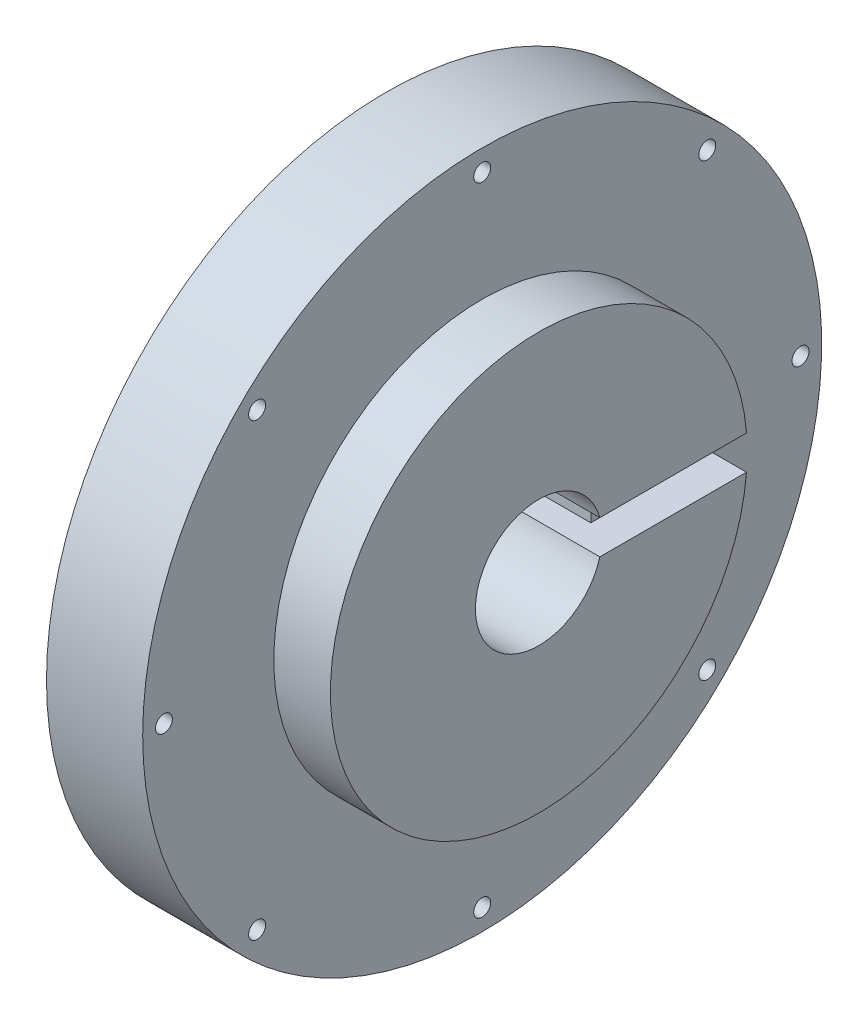
ISO-10303-21;
HEADER;
FILE_DESCRIPTION(('STEP AP214'),'2;1');
FILE_NAME('part.step','',(''),(''),'','','');
FILE_SCHEMA(('AUTOMOTIVE_DESIGN { 1 0 10303 214 1 1 1 1 }'));
ENDSEC;
DATA;
#1=APPLICATION_CONTEXT('core data for automotive mechanical design processes');
#2=APPLICATION_PROTOCOL_DEFINITION('international standard','automotive_design',2000,#1);
#3=PRODUCT_CONTEXT('',#1,'mechanical');
#4=PRODUCT('Part','Part','',(#3));
#5=PRODUCT_RELATED_PRODUCT_CATEGORY('part','',(#4));
#6=PRODUCT_DEFINITION_FORMATION('','',#4);
#7=PRODUCT_DEFINITION_CONTEXT('part definition',#1,'design');
#8=PRODUCT_DEFINITION('design','',#6,#7);
#9=PRODUCT_DEFINITION_SHAPE('','',#8);
#10=(LENGTH_UNIT() NAMED_UNIT(*) SI_UNIT(.MILLI.,.METRE.));
#11=(NAMED_UNIT(*) PLANE_ANGLE_UNIT() SI_UNIT($,.RADIAN.));
#12=(NAMED_UNIT(*) SI_UNIT($,.STERADIAN.) SOLID_ANGLE_UNIT());
#13=UNCERTAINTY_MEASURE_WITH_UNIT(LENGTH_MEASURE(1.E-05),#10,'distance_accuracy_value','');
#14=(GEOMETRIC_REPRESENTATION_CONTEXT(3) GLOBAL_UNCERTAINTY_ASSIGNED_CONTEXT((#13)) GLOBAL_UNIT_ASSIGNED_CONTEXT((#10,
#11,#12)) REPRESENTATION_CONTEXT('',''));
#15=CARTESIAN_POINT('',(0.,0.,0.));
#16=DIRECTION('',(0.,0.,1.));
#17=DIRECTION('',(1.,0.,0.));
#18=AXIS2_PLACEMENT_3D('',#15,#16,#17);
#19=CARTESIAN_POINT('',(51.,63.,-15.2));
#20=DIRECTION('',(0.,0.,1.));
#21=DIRECTION('',(1.,0.,0.));
#22=AXIS2_PLACEMENT_3D('',#19,#20,#21);
#23=PLANE('',#22);
#24=DIRECTION('',(-1.,0.,0.));
#25=VECTOR('',#24,1.);
#26=CARTESIAN_POINT('',(51.,57.,-15.2));
#27=LINE('',#26,#25);
#28=CARTESIAN_POINT('',(4.00000000000002,57.,-15.2));
#29=VERTEX_POINT('',#28);
#30=CARTESIAN_POINT('',(-23.,57.,-15.2));
#31=VERTEX_POINT('',#30);
#32=EDGE_CURVE('E123',#29,#31,#27,.T.);
#33=ORIENTED_EDGE('',*,*,#32,.F.);
#34=DIRECTION('',(0.,-1.,0.));
#35=VECTOR('',#34,1.);
#36=CARTESIAN_POINT('',(4.00000000000001,63.,-15.2));
#37=LINE('',#36,#35);
#38=CARTESIAN_POINT('',(4.00000000000001,63.,-15.2));
#39=VERTEX_POINT('',#38);
#40=EDGE_CURVE('E63',#39,#29,#37,.T.);
#41=ORIENTED_EDGE('',*,*,#40,.F.);
#42=DIRECTION('',(-1.,0.,0.));
#43=VECTOR('',#42,1.);
#44=CARTESIAN_POINT('',(51.,63.,-15.2));
#45=LINE('',#44,#43);
#46=CARTESIAN_POINT('',(-23.,63.,-15.2));
#47=VERTEX_POINT('',#46);
#48=EDGE_CURVE('E114',#39,#47,#45,.T.);
#49=ORIENTED_EDGE('',*,*,#48,.T.);
#50=DIRECTION('',(0.,1.,0.));
#51=VECTOR('',#50,1.);
#52=CARTESIAN_POINT('',(-23.,63.,-15.2));
#53=LINE('',#52,#51);
#54=EDGE_CURVE('E118',#31,#47,#53,.T.);
#55=ORIENTED_EDGE('',*,*,#54,.F.);
#56=EDGE_LOOP('',(#33,#41,#49,#55));
#57=FACE_BOUND('',#56,.T.);
#58=ADVANCED_FACE('F45',(#57),#23,.T.);
#59=CARTESIAN_POINT('',(10.,60.,0.));
#60=DIRECTION('',(1.,0.,0.));
#61=DIRECTION('',(0.,0.,-1.));
#62=AXIS2_PLACEMENT_3D('',#59,#60,#61);
#63=PLANE('',#62);
#64=DIRECTION('',(0.,0.,-1.));
#65=VECTOR('',#64,1.);
#66=CARTESIAN_POINT('',(10.,63.,0.));
#67=LINE('',#66,#65);
#68=CARTESIAN_POINT('',(10.,63.,-10.790736768173));
#69=VERTEX_POINT('',#68);
#70=CARTESIAN_POINT('',(10.,63.,-36.7076136516663));
#71=VERTEX_POINT('',#70);
#72=EDGE_CURVE('E71',#69,#71,#67,.T.);
#73=ORIENTED_EDGE('',*,*,#72,.T.);
#74=CARTESIAN_POINT('',(10.,60.,0.));
#75=DIRECTION('',(1.,0.,0.));
#76=DIRECTION('',(0.,0.,-1.));
#77=AXIS2_PLACEMENT_3D('',#74,#75,#76);
#78=CIRCLE('',#77,36.83);
#79=CARTESIAN_POINT('',(10.,57.,-36.7076136516663));
#80=VERTEX_POINT('',#79);
#81=EDGE_CURVE('E269',#71,#80,#78,.T.);
#82=ORIENTED_EDGE('',*,*,#81,.T.);
#83=DIRECTION('',(0.,0.,1.));
#84=VECTOR('',#83,1.);
#85=CARTESIAN_POINT('',(10.,57.,0.));
#86=LINE('',#85,#84);
#87=CARTESIAN_POINT('',(10.,57.,-10.790736768173));
#88=VERTEX_POINT('',#87);
#89=EDGE_CURVE('E181',#80,#88,#86,.T.);
#90=ORIENTED_EDGE('',*,*,#89,.T.);
#91=CARTESIAN_POINT('',(10.,60.,0.));
#92=DIRECTION('',(1.,0.,0.));
#93=DIRECTION('',(0.,0.,-1.));
#94=AXIS2_PLACEMENT_3D('',#91,#92,#93);
#95=CIRCLE('',#94,11.2);
#96=EDGE_CURVE('E190',#69,#88,#95,.T.);
#97=ORIENTED_EDGE('',*,*,#96,.F.);
#98=EDGE_LOOP('',(#73,#82,#90,#97));
#99=FACE_BOUND('',#98,.T.);
#100=ADVANCED_FACE('F359',(#99),#63,.T.);
#101=CARTESIAN_POINT('',(-19.,60.,0.));
#102=DIRECTION('',(1.,0.,0.));
#103=DIRECTION('',(0.,0.,-1.));
#104=AXIS2_PLACEMENT_3D('',#101,#102,#103);
#105=CYLINDRICAL_SURFACE('',#104,11.2);
#106=DIRECTION('',(1.,0.,0.));
#107=VECTOR('',#106,1.);
#108=CARTESIAN_POINT('',(-19.,63.,-10.790736768173));
#109=LINE('',#108,#107);
#110=CARTESIAN_POINT('',(-19.,63.,-10.790736768173));
#111=VERTEX_POINT('',#110);
#112=EDGE_CURVE('E185',#69,#111,#109,.F.);
#113=ORIENTED_EDGE('',*,*,#112,.F.);
#114=ORIENTED_EDGE('',*,*,#96,.T.);
#115=DIRECTION('',(1.,0.,0.));
#116=VECTOR('',#115,1.);
#117=CARTESIAN_POINT('',(-19.,57.,-10.790736768173));
#118=LINE('',#117,#116);
#119=CARTESIAN_POINT('',(-19.,57.,-10.790736768173));
#120=VERTEX_POINT('',#119);
#121=EDGE_CURVE('E122',#120,#88,#118,.T.);
#122=ORIENTED_EDGE('',*,*,#121,.F.);
#123=CARTESIAN_POINT('',(-19.,60.,0.));
#124=DIRECTION('',(1.,0.,0.));
#125=DIRECTION('',(0.,0.,-1.));
#126=AXIS2_PLACEMENT_3D('',#123,#124,#125);
#127=CIRCLE('',#126,11.2);
#128=EDGE_CURVE('E191',#111,#120,#127,.T.);
#129=ORIENTED_EDGE('',*,*,#128,.F.);
#130=EDGE_LOOP('',(#113,#114,#122,#129));
#131=FACE_BOUND('',#130,.T.);
#132=ADVANCED_FACE('F366',(#131),#105,.F.);
#133=CARTESIAN_POINT('',(0.,60.,0.));
#134=DIRECTION('',(1.,0.,0.));
#135=DIRECTION('',(0.,0.,-1.));
#136=AXIS2_PLACEMENT_3D('',#133,#134,#135);
#137=PLANE('',#136);
#138=CARTESIAN_POINT('',(0.,59.9999999999998,56.25));
#139=DIRECTION('',(1.,0.,0.));
#140=DIRECTION('',(0.,0.,-1.));
#141=AXIS2_PLACEMENT_3D('',#138,#139,#140);
#142=CIRCLE('',#141,1.5);
#143=CARTESIAN_POINT('',(0.,59.9999999999998,54.75));
#144=VERTEX_POINT('',#143);
#145=EDGE_CURVE('E260',#144,#144,#142,.T.);
#146=ORIENTED_EDGE('',*,*,#145,.F.);
#147=EDGE_LOOP('',(#146));
#148=FACE_BOUND('',#147,.T.);
#149=CARTESIAN_POINT('',(0.,20.2252435582565,39.7747564417431));
#150=DIRECTION('',(1.,0.,0.));
#151=DIRECTION('',(0.,0.,-1.));
#152=AXIS2_PLACEMENT_3D('',#149,#150,#151);
#153=CIRCLE('',#152,1.5);
#154=CARTESIAN_POINT('',(0.,20.2252435582565,38.2747564417431));
#155=VERTEX_POINT('',#154);
#156=EDGE_CURVE('E256',#155,#155,#153,.T.);
#157=ORIENTED_EDGE('',*,*,#156,.F.);
#158=EDGE_LOOP('',(#157));
#159=FACE_BOUND('',#158,.T.);
#160=CARTESIAN_POINT('',(0.,3.75,0.));
#161=DIRECTION('',(1.,0.,0.));
#162=DIRECTION('',(0.,0.,-1.));
#163=AXIS2_PLACEMENT_3D('',#160,#161,#162);
#164=CIRCLE('',#163,1.5);
#165=CARTESIAN_POINT('',(0.,3.75,-1.5));
#166=VERTEX_POINT('',#165);
#167=EDGE_CURVE('E251',#166,#166,#164,.T.);
#168=ORIENTED_EDGE('',*,*,#167,.F.);
#169=EDGE_LOOP('',(#168));
#170=FACE_BOUND('',#169,.T.);
#171=CARTESIAN_POINT('',(0.,20.2252435582571,-39.7747564417436));
#172=DIRECTION('',(1.,0.,0.));
#173=DIRECTION('',(0.,0.,-1.));
#174=AXIS2_PLACEMENT_3D('',#171,#172,#173);
#175=CIRCLE('',#174,1.5);
#176=CARTESIAN_POINT('',(0.,20.2252435582571,-41.2747564417436));
#177=VERTEX_POINT('',#176);
#178=EDGE_CURVE('E246',#177,#177,#175,.T.);
#179=ORIENTED_EDGE('',*,*,#178,.F.);
#180=EDGE_LOOP('',(#179));
#181=FACE_BOUND('',#180,.T.);
#182=CARTESIAN_POINT('',(0.,60.0000000000006,-56.25));
#183=DIRECTION('',(1.,0.,0.));
#184=DIRECTION('',(0.,0.,-1.));
#185=AXIS2_PLACEMENT_3D('',#182,#183,#184);
#186=CIRCLE('',#185,1.5);
#187=CARTESIAN_POINT('',(0.,60.0000000000006,-57.75));
#188=VERTEX_POINT('',#187);
#189=EDGE_CURVE('E241',#188,#188,#186,.T.);
#190=ORIENTED_EDGE('',*,*,#189,.F.);
#191=EDGE_LOOP('',(#190));
#192=FACE_BOUND('',#191,.T.);
#193=CARTESIAN_POINT('',(0.,99.7747564417438,-39.7747564417428));
#194=DIRECTION('',(1.,0.,0.));
#195=DIRECTION('',(0.,0.,-1.));
#196=AXIS2_PLACEMENT_3D('',#193,#194,#195);
#197=CIRCLE('',#196,1.5);
#198=CARTESIAN_POINT('',(0.,99.7747564417438,-41.2747564417428));
#199=VERTEX_POINT('',#198);
#200=EDGE_CURVE('E236',#199,#199,#197,.T.);
#201=ORIENTED_EDGE('',*,*,#200,.F.);
#202=EDGE_LOOP('',(#201));
#203=FACE_BOUND('',#202,.T.);
#204=CARTESIAN_POINT('',(0.,99.7747564417432,39.7747564417434));
#205=DIRECTION('',(1.,0.,0.));
#206=DIRECTION('',(0.,0.,-1.));
#207=AXIS2_PLACEMENT_3D('',#204,#205,#206);
#208=CIRCLE('',#207,1.5);
#209=CARTESIAN_POINT('',(0.,99.7747564417432,38.2747564417434));
#210=VERTEX_POINT('',#209);
#211=EDGE_CURVE('E231',#210,#210,#208,.T.);
#212=ORIENTED_EDGE('',*,*,#211,.F.);
#213=EDGE_LOOP('',(#212));
#214=FACE_BOUND('',#213,.T.);
#215=CARTESIAN_POINT('',(0.,116.25,0.));
#216=DIRECTION('',(1.,0.,0.));
#217=DIRECTION('',(0.,0.,-1.));
#218=AXIS2_PLACEMENT_3D('',#215,#216,#217);
#219=CIRCLE('',#218,1.5);
#220=CARTESIAN_POINT('',(0.,116.25,-1.5));
#221=VERTEX_POINT('',#220);
#222=EDGE_CURVE('E265',#221,#221,#219,.T.);
#223=ORIENTED_EDGE('',*,*,#222,.F.);
#224=EDGE_LOOP('',(#223));
#225=FACE_BOUND('',#224,.T.);
#226=CARTESIAN_POINT('',(0.,60.,0.));
#227=DIRECTION('',(1.,0.,0.));
#228=DIRECTION('',(0.,0.,-1.));
#229=AXIS2_PLACEMENT_3D('',#226,#227,#228);
#230=CIRCLE('',#229,36.83);
#231=CARTESIAN_POINT('',(0.,60.,-36.83));
#232=VERTEX_POINT('',#231);
#233=EDGE_CURVE('E55',#232,#232,#230,.T.);
#234=ORIENTED_EDGE('',*,*,#233,.F.);
#235=EDGE_LOOP('',(#234));
#236=FACE_BOUND('',#235,.T.);
#237=CARTESIAN_POINT('',(0.,60.,0.));
#238=DIRECTION('',(-1.,0.,0.));
#239=DIRECTION('',(0.,0.,1.));
#240=AXIS2_PLACEMENT_3D('',#237,#238,#239);
#241=CIRCLE('',#240,60.);
#242=CARTESIAN_POINT('',(0.,60.,60.));
#243=VERTEX_POINT('',#242);
#244=EDGE_CURVE('E277',#243,#243,#241,.T.);
#245=ORIENTED_EDGE('',*,*,#244,.F.);
#246=EDGE_LOOP('',(#245));
#247=FACE_BOUND('',#246,.T.);
#248=ADVANCED_FACE('F47',(#148,#159,#170,#181,#192,#203,#214,#225,#236,#247),#137,.T.);
#249=CARTESIAN_POINT('',(-27.05,60.,0.));
#250=DIRECTION('',(-1.,0.,0.));
#251=DIRECTION('',(0.,0.,1.));
#252=AXIS2_PLACEMENT_3D('',#249,#250,#251);
#253=CYLINDRICAL_SURFACE('',#252,60.);
#254=ORIENTED_EDGE('',*,*,#244,.T.);
#255=EDGE_LOOP('',(#254));
#256=FACE_BOUND('',#255,.T.);
#257=CARTESIAN_POINT('',(-17.,60.,0.));
#258=DIRECTION('',(-1.,0.,0.));
#259=DIRECTION('',(0.,0.,1.));
#260=AXIS2_PLACEMENT_3D('',#257,#258,#259);
#261=CIRCLE('',#260,60.);
#262=CARTESIAN_POINT('',(-17.,60.,60.));
#263=VERTEX_POINT('',#262);
#264=EDGE_CURVE('E285',#263,#263,#261,.T.);
#265=ORIENTED_EDGE('',*,*,#264,.F.);
#266=EDGE_LOOP('',(#265));
#267=FACE_BOUND('',#266,.T.);
#268=ADVANCED_FACE('F319',(#256,#267),#253,.T.);
#269=CARTESIAN_POINT('',(-17.,0.,0.));
#270=DIRECTION('',(-1.,0.,0.));
#271=DIRECTION('',(0.,0.,1.));
#272=AXIS2_PLACEMENT_3D('',#269,#270,#271);
#273=PLANE('',#272);
#274=CARTESIAN_POINT('',(-17.,59.9999999999998,56.25));
#275=DIRECTION('',(-1.,0.,0.));
#276=DIRECTION('',(0.,0.,1.));
#277=AXIS2_PLACEMENT_3D('',#274,#275,#276);
#278=CIRCLE('',#277,1.5);
#279=CARTESIAN_POINT('',(-17.,59.9999999999998,57.75));
#280=VERTEX_POINT('',#279);
#281=EDGE_CURVE('E49',#280,#280,#278,.T.);
#282=ORIENTED_EDGE('',*,*,#281,.F.);
#283=EDGE_LOOP('',(#282));
#284=FACE_BOUND('',#283,.T.);
#285=CARTESIAN_POINT('',(-17.,20.2252435582565,39.7747564417431));
#286=DIRECTION('',(-1.,0.,0.));
#287=DIRECTION('',(0.,0.,1.));
#288=AXIS2_PLACEMENT_3D('',#285,#286,#287);
#289=CIRCLE('',#288,1.5);
#290=CARTESIAN_POINT('',(-17.,20.2252435582565,41.2747564417431));
#291=VERTEX_POINT('',#290);
#292=EDGE_CURVE('E255',#291,#291,#289,.T.);
#293=ORIENTED_EDGE('',*,*,#292,.F.);
#294=EDGE_LOOP('',(#293));
#295=FACE_BOUND('',#294,.T.);
#296=CARTESIAN_POINT('',(-17.,3.75,0.));
#297=DIRECTION('',(-1.,0.,0.));
#298=DIRECTION('',(0.,0.,1.));
#299=AXIS2_PLACEMENT_3D('',#296,#297,#298);
#300=CIRCLE('',#299,1.5);
#301=CARTESIAN_POINT('',(-17.,3.75,1.5));
#302=VERTEX_POINT('',#301);
#303=EDGE_CURVE('E250',#302,#302,#300,.T.);
#304=ORIENTED_EDGE('',*,*,#303,.F.);
#305=EDGE_LOOP('',(#304));
#306=FACE_BOUND('',#305,.T.);
#307=CARTESIAN_POINT('',(-17.,20.2252435582571,-39.7747564417436));
#308=DIRECTION('',(-1.,0.,0.));
#309=DIRECTION('',(0.,0.,1.));
#310=AXIS2_PLACEMENT_3D('',#307,#308,#309);
#311=CIRCLE('',#310,1.5);
#312=CARTESIAN_POINT('',(-17.,20.2252435582571,-38.2747564417436));
#313=VERTEX_POINT('',#312);
#314=EDGE_CURVE('E245',#313,#313,#311,.T.);
#315=ORIENTED_EDGE('',*,*,#314,.F.);
#316=EDGE_LOOP('',(#315));
#317=FACE_BOUND('',#316,.T.);
#318=CARTESIAN_POINT('',(-17.,60.0000000000006,-56.25));
#319=DIRECTION('',(-1.,0.,0.));
#320=DIRECTION('',(0.,0.,1.));
#321=AXIS2_PLACEMENT_3D('',#318,#319,#320);
#322=CIRCLE('',#321,1.5);
#323=CARTESIAN_POINT('',(-17.,60.0000000000006,-54.75));
#324=VERTEX_POINT('',#323);
#325=EDGE_CURVE('E240',#324,#324,#322,.T.);
#326=ORIENTED_EDGE('',*,*,#325,.F.);
#327=EDGE_LOOP('',(#326));
#328=FACE_BOUND('',#327,.T.);
#329=CARTESIAN_POINT('',(-17.,99.7747564417438,-39.7747564417428));
#330=DIRECTION('',(-1.,0.,0.));
#331=DIRECTION('',(0.,0.,1.));
#332=AXIS2_PLACEMENT_3D('',#329,#330,#331);
#333=CIRCLE('',#332,1.5);
#334=CARTESIAN_POINT('',(-17.,99.7747564417438,-38.2747564417428));
#335=VERTEX_POINT('',#334);
#336=EDGE_CURVE('E235',#335,#335,#333,.T.);
#337=ORIENTED_EDGE('',*,*,#336,.F.);
#338=EDGE_LOOP('',(#337));
#339=FACE_BOUND('',#338,.T.);
#340=CARTESIAN_POINT('',(-17.,99.7747564417432,39.7747564417434));
#341=DIRECTION('',(-1.,0.,0.));
#342=DIRECTION('',(0.,0.,1.));
#343=AXIS2_PLACEMENT_3D('',#340,#341,#342);
#344=CIRCLE('',#343,1.5);
#345=CARTESIAN_POINT('',(-17.,99.7747564417432,41.2747564417434));
#346=VERTEX_POINT('',#345);
#347=EDGE_CURVE('E227',#346,#346,#344,.T.);
#348=ORIENTED_EDGE('',*,*,#347,.F.);
#349=EDGE_LOOP('',(#348));
#350=FACE_BOUND('',#349,.T.);
#351=CARTESIAN_POINT('',(-17.,116.25,0.));
#352=DIRECTION('',(-1.,0.,0.));
#353=DIRECTION('',(0.,0.,1.));
#354=AXIS2_PLACEMENT_3D('',#351,#352,#353);
#355=CIRCLE('',#354,1.5);
#356=CARTESIAN_POINT('',(-17.,116.25,1.5));
#357=VERTEX_POINT('',#356);
#358=EDGE_CURVE('E264',#357,#357,#355,.T.);
#359=ORIENTED_EDGE('',*,*,#358,.F.);
#360=EDGE_LOOP('',(#359));
#361=FACE_BOUND('',#360,.T.);
#362=ORIENTED_EDGE('',*,*,#264,.T.);
#363=EDGE_LOOP('',(#362));
#364=FACE_BOUND('',#363,.T.);
#365=CARTESIAN_POINT('',(-17.,60.,0.));
#366=DIRECTION('',(-1.,0.,0.));
#367=DIRECTION('',(0.,0.,1.));
#368=AXIS2_PLACEMENT_3D('',#365,#366,#367);
#369=CIRCLE('',#368,35.);
#370=CARTESIAN_POINT('',(-17.,60.,35.));
#371=VERTEX_POINT('',#370);
#372=EDGE_CURVE('E281',#371,#371,#369,.T.);
#373=ORIENTED_EDGE('',*,*,#372,.F.);
#374=EDGE_LOOP('',(#373));
#375=FACE_BOUND('',#374,.T.);
#376=ADVANCED_FACE('F315',(#284,#295,#306,#317,#328,#339,#350,#361,#364,#375),#273,.T.);
#377=CARTESIAN_POINT('',(-27.05,60.,0.));
#378=DIRECTION('',(-1.,0.,0.));
#379=DIRECTION('',(0.,0.,1.));
#380=AXIS2_PLACEMENT_3D('',#377,#378,#379);
#381=CYLINDRICAL_SURFACE('',#380,35.);
#382=ORIENTED_EDGE('',*,*,#372,.T.);
#383=EDGE_LOOP('',(#382));
#384=FACE_BOUND('',#383,.T.);
#385=CARTESIAN_POINT('',(-27.05,60.,0.));
#386=DIRECTION('',(-1.,0.,0.));
#387=DIRECTION('',(0.,0.,1.));
#388=AXIS2_PLACEMENT_3D('',#385,#386,#387);
#389=CIRCLE('',#388,35.);
#390=CARTESIAN_POINT('',(-27.05,60.,35.));
#391=VERTEX_POINT('',#390);
#392=EDGE_CURVE('E273',#391,#391,#389,.T.);
#393=ORIENTED_EDGE('',*,*,#392,.F.);
#394=EDGE_LOOP('',(#393));
#395=FACE_BOUND('',#394,.T.);
#396=ADVANCED_FACE('F318',(#384,#395),#381,.T.);
#397=CARTESIAN_POINT('',(-27.05,25.,0.));
#398=DIRECTION('',(-1.,0.,0.));
#399=DIRECTION('',(0.,0.,1.));
#400=AXIS2_PLACEMENT_3D('',#397,#398,#399);
#401=PLANE('',#400);
#402=CARTESIAN_POINT('',(-27.05,41.44,-18.56));
#403=DIRECTION('',(-1.,0.,0.));
#404=DIRECTION('',(0.,0.,1.));
#405=AXIS2_PLACEMENT_3D('',#402,#403,#404);
#406=CIRCLE('',#405,2.);
#407=CARTESIAN_POINT('',(-27.05,41.44,-16.56));
#408=VERTEX_POINT('',#407);
#409=EDGE_CURVE('E216',#408,#408,#406,.T.);
#410=ORIENTED_EDGE('',*,*,#409,.F.);
#411=EDGE_LOOP('',(#410));
#412=FACE_BOUND('',#411,.T.);
#413=CARTESIAN_POINT('',(-27.05,41.44,18.56));
#414=DIRECTION('',(-1.,0.,0.));
#415=DIRECTION('',(0.,0.,1.));
#416=AXIS2_PLACEMENT_3D('',#413,#414,#415);
#417=CIRCLE('',#416,2.);
#418=CARTESIAN_POINT('',(-27.05,41.44,20.56));
#419=VERTEX_POINT('',#418);
#420=EDGE_CURVE('E208',#419,#419,#417,.T.);
#421=ORIENTED_EDGE('',*,*,#420,.F.);
#422=EDGE_LOOP('',(#421));
#423=FACE_BOUND('',#422,.T.);
#424=CARTESIAN_POINT('',(-27.05,78.56,18.56));
#425=DIRECTION('',(-1.,0.,0.));
#426=DIRECTION('',(0.,0.,1.));
#427=AXIS2_PLACEMENT_3D('',#424,#425,#426);
#428=CIRCLE('',#427,2.);
#429=CARTESIAN_POINT('',(-27.05,78.56,20.56));
#430=VERTEX_POINT('',#429);
#431=EDGE_CURVE('E199',#430,#430,#428,.T.);
#432=ORIENTED_EDGE('',*,*,#431,.F.);
#433=EDGE_LOOP('',(#432));
#434=FACE_BOUND('',#433,.T.);
#435=CARTESIAN_POINT('',(-27.05,78.56,-18.56));
#436=DIRECTION('',(-1.,0.,0.));
#437=DIRECTION('',(0.,0.,1.));
#438=AXIS2_PLACEMENT_3D('',#435,#436,#437);
#439=CIRCLE('',#438,2.);
#440=CARTESIAN_POINT('',(-27.05,78.56,-16.56));
#441=VERTEX_POINT('',#440);
#442=EDGE_CURVE('E203',#441,#441,#439,.T.);
#443=ORIENTED_EDGE('',*,*,#442,.F.);
#444=EDGE_LOOP('',(#443));
#445=FACE_BOUND('',#444,.T.);
#446=ORIENTED_EDGE('',*,*,#392,.T.);
#447=EDGE_LOOP('',(#446));
#448=FACE_BOUND('',#447,.T.);
#449=ADVANCED_FACE('F340',(#412,#423,#434,#445,#448),#401,.T.);
#450=CARTESIAN_POINT('',(10.,60.,0.));
#451=DIRECTION('',(-1.,0.,0.));
#452=DIRECTION('',(0.,0.,1.));
#453=AXIS2_PLACEMENT_3D('',#450,#451,#452);
#454=CYLINDRICAL_SURFACE('',#453,36.83);
#455=ORIENTED_EDGE('',*,*,#81,.F.);
#456=DIRECTION('',(-1.,0.,0.));
#457=VECTOR('',#456,1.);
#458=CARTESIAN_POINT('',(10.,63.,-36.7076136516663));
#459=LINE('',#458,#457);
#460=CARTESIAN_POINT('',(4.00000000000001,63.,-36.7076136516663));
#461=VERTEX_POINT('',#460);
#462=EDGE_CURVE('E173',#71,#461,#459,.T.);
#463=ORIENTED_EDGE('',*,*,#462,.T.);
#464=CARTESIAN_POINT('',(4.00000000000001,60.,0.));
#465=DIRECTION('',(1.,0.,0.));
#466=DIRECTION('',(0.,0.,-1.));
#467=AXIS2_PLACEMENT_3D('',#464,#465,#466);
#468=CIRCLE('',#467,36.83);
#469=CARTESIAN_POINT('',(4.00000000000001,57.,-36.7076136516663));
#470=VERTEX_POINT('',#469);
#471=EDGE_CURVE('E166',#470,#461,#468,.T.);
#472=ORIENTED_EDGE('',*,*,#471,.F.);
#473=DIRECTION('',(-1.,0.,0.));
#474=VECTOR('',#473,1.);
#475=CARTESIAN_POINT('',(10.,57.,-36.7076136516663));
#476=LINE('',#475,#474);
#477=EDGE_CURVE('E169',#470,#80,#476,.F.);
#478=ORIENTED_EDGE('',*,*,#477,.T.);
#479=EDGE_LOOP('',(#455,#463,#472,#478));
#480=FACE_BOUND('',#479,.T.);
#481=ORIENTED_EDGE('',*,*,#233,.T.);
#482=EDGE_LOOP('',(#481));
#483=FACE_BOUND('',#482,.T.);
#484=ADVANCED_FACE('F345',(#480,#483),#454,.T.);
#485=CARTESIAN_POINT('',(-27.05,116.25,0.));
#486=DIRECTION('',(1.,0.,0.));
#487=DIRECTION('',(0.,0.,-1.));
#488=AXIS2_PLACEMENT_3D('',#485,#486,#487);
#489=CYLINDRICAL_SURFACE('',#488,1.5);
#490=ORIENTED_EDGE('',*,*,#222,.T.);
#491=EDGE_LOOP('',(#490));
#492=FACE_BOUND('',#491,.T.);
#493=ORIENTED_EDGE('',*,*,#358,.T.);
#494=EDGE_LOOP('',(#493));
#495=FACE_BOUND('',#494,.T.);
#496=ADVANCED_FACE('F353',(#492,#495),#489,.F.);
#497=CARTESIAN_POINT('',(-27.05,99.7747564417432,39.7747564417434));
#498=DIRECTION('',(1.,0.,0.));
#499=DIRECTION('',(0.,0.,-1.));
#500=AXIS2_PLACEMENT_3D('',#497,#498,#499);
#501=CYLINDRICAL_SURFACE('',#500,1.5);
#502=ORIENTED_EDGE('',*,*,#211,.T.);
#503=EDGE_LOOP('',(#502));
#504=FACE_BOUND('',#503,.T.);
#505=ORIENTED_EDGE('',*,*,#347,.T.);
#506=EDGE_LOOP('',(#505));
#507=FACE_BOUND('',#506,.T.);
#508=ADVANCED_FACE('F418',(#504,#507),#501,.F.);
#509=CARTESIAN_POINT('',(-27.05,99.7747564417438,-39.7747564417428));
#510=DIRECTION('',(1.,0.,0.));
#511=DIRECTION('',(0.,0.,-1.));
#512=AXIS2_PLACEMENT_3D('',#509,#510,#511);
#513=CYLINDRICAL_SURFACE('',#512,1.5);
#514=ORIENTED_EDGE('',*,*,#200,.T.);
#515=EDGE_LOOP('',(#514));
#516=FACE_BOUND('',#515,.T.);
#517=ORIENTED_EDGE('',*,*,#336,.T.);
#518=EDGE_LOOP('',(#517));
#519=FACE_BOUND('',#518,.T.);
#520=ADVANCED_FACE('F414',(#516,#519),#513,.F.);
#521=CARTESIAN_POINT('',(-27.05,60.0000000000006,-56.25));
#522=DIRECTION('',(1.,0.,0.));
#523=DIRECTION('',(0.,0.,-1.));
#524=AXIS2_PLACEMENT_3D('',#521,#522,#523);
#525=CYLINDRICAL_SURFACE('',#524,1.5);
#526=ORIENTED_EDGE('',*,*,#189,.T.);
#527=EDGE_LOOP('',(#526));
#528=FACE_BOUND('',#527,.T.);
#529=ORIENTED_EDGE('',*,*,#325,.T.);
#530=EDGE_LOOP('',(#529));
#531=FACE_BOUND('',#530,.T.);
#532=ADVANCED_FACE('F410',(#528,#531),#525,.F.);
#533=CARTESIAN_POINT('',(-27.05,20.2252435582571,-39.7747564417436));
#534=DIRECTION('',(1.,0.,0.));
#535=DIRECTION('',(0.,0.,-1.));
#536=AXIS2_PLACEMENT_3D('',#533,#534,#535);
#537=CYLINDRICAL_SURFACE('',#536,1.5);
#538=ORIENTED_EDGE('',*,*,#178,.T.);
#539=EDGE_LOOP('',(#538));
#540=FACE_BOUND('',#539,.T.);
#541=ORIENTED_EDGE('',*,*,#314,.T.);
#542=EDGE_LOOP('',(#541));
#543=FACE_BOUND('',#542,.T.);
#544=ADVANCED_FACE('F413',(#540,#543),#537,.F.);
#545=CARTESIAN_POINT('',(-27.05,3.75,0.));
#546=DIRECTION('',(1.,0.,0.));
#547=DIRECTION('',(0.,0.,-1.));
#548=AXIS2_PLACEMENT_3D('',#545,#546,#547);
#549=CYLINDRICAL_SURFACE('',#548,1.5);
#550=ORIENTED_EDGE('',*,*,#167,.T.);
#551=EDGE_LOOP('',(#550));
#552=FACE_BOUND('',#551,.T.);
#553=ORIENTED_EDGE('',*,*,#303,.T.);
#554=EDGE_LOOP('',(#553));
#555=FACE_BOUND('',#554,.T.);
#556=ADVANCED_FACE('F424',(#552,#555),#549,.F.);
#557=CARTESIAN_POINT('',(-27.05,20.2252435582565,39.7747564417431));
#558=DIRECTION('',(1.,0.,0.));
#559=DIRECTION('',(0.,0.,-1.));
#560=AXIS2_PLACEMENT_3D('',#557,#558,#559);
#561=CYLINDRICAL_SURFACE('',#560,1.5);
#562=ORIENTED_EDGE('',*,*,#156,.T.);
#563=EDGE_LOOP('',(#562));
#564=FACE_BOUND('',#563,.T.);
#565=ORIENTED_EDGE('',*,*,#292,.T.);
#566=EDGE_LOOP('',(#565));
#567=FACE_BOUND('',#566,.T.);
#568=ADVANCED_FACE('F313',(#564,#567),#561,.F.);
#569=CARTESIAN_POINT('',(-27.05,59.9999999999998,56.25));
#570=DIRECTION('',(1.,0.,0.));
#571=DIRECTION('',(0.,0.,-1.));
#572=AXIS2_PLACEMENT_3D('',#569,#570,#571);
#573=CYLINDRICAL_SURFACE('',#572,1.5);
#574=ORIENTED_EDGE('',*,*,#145,.T.);
#575=EDGE_LOOP('',(#574));
#576=FACE_BOUND('',#575,.T.);
#577=ORIENTED_EDGE('',*,*,#281,.T.);
#578=EDGE_LOOP('',(#577));
#579=FACE_BOUND('',#578,.T.);
#580=ADVANCED_FACE('F408',(#576,#579),#573,.F.);
#581=CARTESIAN_POINT('',(-17.05,78.56,-18.56));
#582=DIRECTION('',(-1.,0.,0.));
#583=DIRECTION('',(0.,0.,1.));
#584=AXIS2_PLACEMENT_3D('',#581,#582,#583);
#585=CYLINDRICAL_SURFACE('',#584,2.);
#586=CARTESIAN_POINT('',(-17.05,78.56,-18.56));
#587=DIRECTION('',(-1.,0.,0.));
#588=DIRECTION('',(0.,0.,1.));
#589=AXIS2_PLACEMENT_3D('',#586,#587,#588);
#590=CIRCLE('',#589,2.);
#591=CARTESIAN_POINT('',(-17.05,78.56,-16.56));
#592=VERTEX_POINT('',#591);
#593=EDGE_CURVE('E223',#592,#592,#590,.T.);
#594=ORIENTED_EDGE('',*,*,#593,.F.);
#595=EDGE_LOOP('',(#594));
#596=FACE_BOUND('',#595,.T.);
#597=ORIENTED_EDGE('',*,*,#442,.T.);
#598=EDGE_LOOP('',(#597));
#599=FACE_BOUND('',#598,.T.);
#600=ADVANCED_FACE('F405',(#596,#599),#585,.F.);
#601=CARTESIAN_POINT('',(-17.05,78.56,-18.56));
#602=DIRECTION('',(-1.,0.,0.));
#603=DIRECTION('',(0.,0.,1.));
#604=AXIS2_PLACEMENT_3D('',#601,#602,#603);
#605=PLANE('',#604);
#606=ORIENTED_EDGE('',*,*,#593,.T.);
#607=EDGE_LOOP('',(#606));
#608=FACE_BOUND('',#607,.T.);
#609=ADVANCED_FACE('F383',(#608),#605,.T.);
#610=CARTESIAN_POINT('',(-17.05,78.56,18.56));
#611=DIRECTION('',(-1.,0.,0.));
#612=DIRECTION('',(0.,0.,1.));
#613=AXIS2_PLACEMENT_3D('',#610,#611,#612);
#614=CYLINDRICAL_SURFACE('',#613,2.);
#615=CARTESIAN_POINT('',(-17.05,78.56,18.56));
#616=DIRECTION('',(-1.,0.,0.));
#617=DIRECTION('',(0.,0.,1.));
#618=AXIS2_PLACEMENT_3D('',#615,#616,#617);
#619=CIRCLE('',#618,2.);
#620=CARTESIAN_POINT('',(-17.05,78.56,20.56));
#621=VERTEX_POINT('',#620);
#622=EDGE_CURVE('E204',#621,#621,#619,.T.);
#623=ORIENTED_EDGE('',*,*,#622,.F.);
#624=EDGE_LOOP('',(#623));
#625=FACE_BOUND('',#624,.T.);
#626=ORIENTED_EDGE('',*,*,#431,.T.);
#627=EDGE_LOOP('',(#626));
#628=FACE_BOUND('',#627,.T.);
#629=ADVANCED_FACE('F379',(#625,#628),#614,.F.);
#630=CARTESIAN_POINT('',(-17.05,78.56,18.56));
#631=DIRECTION('',(-1.,0.,0.));
#632=DIRECTION('',(0.,0.,1.));
#633=AXIS2_PLACEMENT_3D('',#630,#631,#632);
#634=PLANE('',#633);
#635=ORIENTED_EDGE('',*,*,#622,.T.);
#636=EDGE_LOOP('',(#635));
#637=FACE_BOUND('',#636,.T.);
#638=ADVANCED_FACE('F382',(#637),#634,.T.);
#639=CARTESIAN_POINT('',(-17.05,41.44,18.56));
#640=DIRECTION('',(-1.,0.,0.));
#641=DIRECTION('',(0.,0.,1.));
#642=AXIS2_PLACEMENT_3D('',#639,#640,#641);
#643=CYLINDRICAL_SURFACE('',#642,2.);
#644=CARTESIAN_POINT('',(-17.05,41.44,18.56));
#645=DIRECTION('',(-1.,0.,0.));
#646=DIRECTION('',(0.,0.,1.));
#647=AXIS2_PLACEMENT_3D('',#644,#645,#646);
#648=CIRCLE('',#647,2.);
#649=CARTESIAN_POINT('',(-17.05,41.44,20.56));
#650=VERTEX_POINT('',#649);
#651=EDGE_CURVE('E212',#650,#650,#648,.T.);
#652=ORIENTED_EDGE('',*,*,#651,.F.);
#653=EDGE_LOOP('',(#652));
#654=FACE_BOUND('',#653,.T.);
#655=ORIENTED_EDGE('',*,*,#420,.T.);
#656=EDGE_LOOP('',(#655));
#657=FACE_BOUND('',#656,.T.);
#658=ADVANCED_FACE('F387',(#654,#657),#643,.F.);
#659=CARTESIAN_POINT('',(-17.05,41.44,18.56));
#660=DIRECTION('',(-1.,0.,0.));
#661=DIRECTION('',(0.,0.,1.));
#662=AXIS2_PLACEMENT_3D('',#659,#660,#661);
#663=PLANE('',#662);
#664=ORIENTED_EDGE('',*,*,#651,.T.);
#665=EDGE_LOOP('',(#664));
#666=FACE_BOUND('',#665,.T.);
#667=ADVANCED_FACE('F391',(#666),#663,.T.);
#668=CARTESIAN_POINT('',(-17.05,41.44,-18.56));
#669=DIRECTION('',(-1.,0.,0.));
#670=DIRECTION('',(0.,0.,1.));
#671=AXIS2_PLACEMENT_3D('',#668,#669,#670);
#672=CYLINDRICAL_SURFACE('',#671,2.);
#673=CARTESIAN_POINT('',(-17.05,41.44,-18.56));
#674=DIRECTION('',(-1.,0.,0.));
#675=DIRECTION('',(0.,0.,1.));
#676=AXIS2_PLACEMENT_3D('',#673,#674,#675);
#677=CIRCLE('',#676,2.);
#678=CARTESIAN_POINT('',(-17.05,41.44,-16.56));
#679=VERTEX_POINT('',#678);
#680=EDGE_CURVE('E195',#679,#679,#677,.T.);
#681=ORIENTED_EDGE('',*,*,#680,.F.);
#682=EDGE_LOOP('',(#681));
#683=FACE_BOUND('',#682,.T.);
#684=ORIENTED_EDGE('',*,*,#409,.T.);
#685=EDGE_LOOP('',(#684));
#686=FACE_BOUND('',#685,.T.);
#687=ADVANCED_FACE('F395',(#683,#686),#672,.F.);
#688=CARTESIAN_POINT('',(-17.05,41.44,-18.56));
#689=DIRECTION('',(-1.,0.,0.));
#690=DIRECTION('',(0.,0.,1.));
#691=AXIS2_PLACEMENT_3D('',#688,#689,#690);
#692=PLANE('',#691);
#693=ORIENTED_EDGE('',*,*,#680,.T.);
#694=EDGE_LOOP('',(#693));
#695=FACE_BOUND('',#694,.T.);
#696=ADVANCED_FACE('F375',(#695),#692,.T.);
#697=CARTESIAN_POINT('',(-19.,60.,0.));
#698=DIRECTION('',(1.,0.,0.));
#699=DIRECTION('',(0.,0.,-1.));
#700=AXIS2_PLACEMENT_3D('',#697,#698,#699);
#701=PLANE('',#700);
#702=DIRECTION('',(0.,0.,1.));
#703=VECTOR('',#702,1.);
#704=CARTESIAN_POINT('',(-19.,63.,-15.2));
#705=LINE('',#704,#703);
#706=CARTESIAN_POINT('',(-19.,63.,1.98964118861895));
#707=VERTEX_POINT('',#706);
#708=EDGE_CURVE('E11',#111,#707,#705,.T.);
#709=ORIENTED_EDGE('',*,*,#708,.F.);
#710=ORIENTED_EDGE('',*,*,#128,.T.);
#711=DIRECTION('',(0.,0.,-1.));
#712=VECTOR('',#711,1.);
#713=CARTESIAN_POINT('',(-19.,57.,-15.2));
#714=LINE('',#713,#712);
#715=CARTESIAN_POINT('',(-19.,57.,1.98964118861895));
#716=VERTEX_POINT('',#715);
#717=EDGE_CURVE('E140',#716,#120,#714,.T.);
#718=ORIENTED_EDGE('',*,*,#717,.F.);
#719=DIRECTION('',(0.,-1.,0.));
#720=VECTOR('',#719,1.);
#721=CARTESIAN_POINT('',(-19.,63.,1.98964118861895));
#722=LINE('',#721,#720);
#723=EDGE_CURVE('E143',#707,#716,#722,.T.);
#724=ORIENTED_EDGE('',*,*,#723,.F.);
#725=EDGE_LOOP('',(#709,#710,#718,#724));
#726=FACE_BOUND('',#725,.T.);
#727=ADVANCED_FACE('F372',(#726),#701,.T.);
#728=CARTESIAN_POINT('',(51.,63.,-7.2));
#729=DIRECTION('',(0.,-1.,0.));
#730=DIRECTION('',(0.,0.,-1.));
#731=AXIS2_PLACEMENT_3D('',#728,#729,#730);
#732=PLANE('',#731);
#733=ORIENTED_EDGE('',*,*,#112,.T.);
#734=ORIENTED_EDGE('',*,*,#708,.T.);
#735=DIRECTION('',(1.,0.,0.));
#736=VECTOR('',#735,1.);
#737=CARTESIAN_POINT('',(-23.,63.,1.98964118861895));
#738=LINE('',#737,#736);
#739=CARTESIAN_POINT('',(-23.,63.,1.98964118861895));
#740=VERTEX_POINT('',#739);
#741=EDGE_CURVE('E129',#740,#707,#738,.T.);
#742=ORIENTED_EDGE('',*,*,#741,.F.);
#743=DIRECTION('',(0.,0.,1.));
#744=VECTOR('',#743,1.);
#745=CARTESIAN_POINT('',(-23.,63.,-15.2));
#746=LINE('',#745,#744);
#747=EDGE_CURVE('E126',#47,#740,#746,.T.);
#748=ORIENTED_EDGE('',*,*,#747,.F.);
#749=ORIENTED_EDGE('',*,*,#48,.F.);
#750=DIRECTION('',(0.,0.,1.));
#751=VECTOR('',#750,1.);
#752=CARTESIAN_POINT('',(4.00000000000001,63.,-15.2));
#753=LINE('',#752,#751);
#754=EDGE_CURVE('E163',#461,#39,#753,.T.);
#755=ORIENTED_EDGE('',*,*,#754,.F.);
#756=ORIENTED_EDGE('',*,*,#462,.F.);
#757=ORIENTED_EDGE('',*,*,#72,.F.);
#758=EDGE_LOOP('',(#733,#734,#742,#748,#749,#755,#756,#757));
#759=FACE_BOUND('',#758,.T.);
#760=ADVANCED_FACE('F127',(#759),#732,.T.);
#761=CARTESIAN_POINT('',(51.,57.,-7.2));
#762=DIRECTION('',(0.,1.,0.));
#763=DIRECTION('',(0.,0.,1.));
#764=AXIS2_PLACEMENT_3D('',#761,#762,#763);
#765=PLANE('',#764);
#766=ORIENTED_EDGE('',*,*,#89,.F.);
#767=ORIENTED_EDGE('',*,*,#477,.F.);
#768=DIRECTION('',(0.,0.,-1.));
#769=VECTOR('',#768,1.);
#770=CARTESIAN_POINT('',(4.00000000000001,57.,-15.2));
#771=LINE('',#770,#769);
#772=EDGE_CURVE('E160',#29,#470,#771,.T.);
#773=ORIENTED_EDGE('',*,*,#772,.F.);
#774=ORIENTED_EDGE('',*,*,#32,.T.);
#775=DIRECTION('',(0.,0.,-1.));
#776=VECTOR('',#775,1.);
#777=CARTESIAN_POINT('',(-23.,57.,-15.2));
#778=LINE('',#777,#776);
#779=CARTESIAN_POINT('',(-23.,57.,1.98964118861895));
#780=VERTEX_POINT('',#779);
#781=EDGE_CURVE('E138',#780,#31,#778,.T.);
#782=ORIENTED_EDGE('',*,*,#781,.F.);
#783=DIRECTION('',(1.,0.,0.));
#784=VECTOR('',#783,1.);
#785=CARTESIAN_POINT('',(-23.,57.,1.98964118861895));
#786=LINE('',#785,#784);
#787=EDGE_CURVE('E153',#780,#716,#786,.T.);
#788=ORIENTED_EDGE('',*,*,#787,.T.);
#789=ORIENTED_EDGE('',*,*,#717,.T.);
#790=ORIENTED_EDGE('',*,*,#121,.T.);
#791=EDGE_LOOP('',(#766,#767,#773,#774,#782,#788,#789,#790));
#792=FACE_BOUND('',#791,.T.);
#793=ADVANCED_FACE('F595',(#792),#765,.T.);
#794=CARTESIAN_POINT('',(4.00000000000001,0.,0.));
#795=DIRECTION('',(1.,0.,0.));
#796=DIRECTION('',(0.,0.,-1.));
#797=AXIS2_PLACEMENT_3D('',#794,#795,#796);
#798=PLANE('',#797);
#799=ORIENTED_EDGE('',*,*,#471,.T.);
#800=ORIENTED_EDGE('',*,*,#754,.T.);
#801=ORIENTED_EDGE('',*,*,#40,.T.);
#802=ORIENTED_EDGE('',*,*,#772,.T.);
#803=EDGE_LOOP('',(#799,#800,#801,#802));
#804=FACE_BOUND('',#803,.T.);
#805=ADVANCED_FACE('F603',(#804),#798,.T.);
#806=CARTESIAN_POINT('',(-23.,63.,1.98964118861895));
#807=DIRECTION('',(0.,0.,1.));
#808=DIRECTION('',(1.,0.,0.));
#809=AXIS2_PLACEMENT_3D('',#806,#807,#808);
#810=PLANE('',#809);
#811=ORIENTED_EDGE('',*,*,#723,.T.);
#812=ORIENTED_EDGE('',*,*,#787,.F.);
#813=DIRECTION('',(0.,-1.,0.));
#814=VECTOR('',#813,1.);
#815=CARTESIAN_POINT('',(-23.,63.,1.98964118861895));
#816=LINE('',#815,#814);
#817=EDGE_CURVE('E134',#740,#780,#816,.T.);
#818=ORIENTED_EDGE('',*,*,#817,.F.);
#819=ORIENTED_EDGE('',*,*,#741,.T.);
#820=EDGE_LOOP('',(#811,#812,#818,#819));
#821=FACE_BOUND('',#820,.T.);
#822=ADVANCED_FACE('F619',(#821),#810,.F.);
#823=CARTESIAN_POINT('',(-23.,0.,0.));
#824=DIRECTION('',(-1.,0.,0.));
#825=DIRECTION('',(0.,0.,1.));
#826=AXIS2_PLACEMENT_3D('',#823,#824,#825);
#827=PLANE('',#826);
#828=ORIENTED_EDGE('',*,*,#54,.T.);
#829=ORIENTED_EDGE('',*,*,#747,.T.);
#830=ORIENTED_EDGE('',*,*,#817,.T.);
#831=ORIENTED_EDGE('',*,*,#781,.T.);
#832=EDGE_LOOP('',(#828,#829,#830,#831));
#833=FACE_BOUND('',#832,.T.);
#834=ADVANCED_FACE('F136',(#833),#827,.F.);
#835=CLOSED_SHELL('',(#58,#100,#132,#248,#268,#376,#396,#449,#484,#496,#508,#520,#532,#544,#556,
#568,#580,#600,#609,#629,#638,#658,#667,#687,#696,#727,#760,#793,#805,#822,#834));
#836=MANIFOLD_SOLID_BREP('B2',#835);
#837=ADVANCED_BREP_SHAPE_REPRESENTATION('',(#18,#836),#14);
#838=SHAPE_DEFINITION_REPRESENTATION(#9,#837);
ENDSEC;
END-ISO-10303-21;
